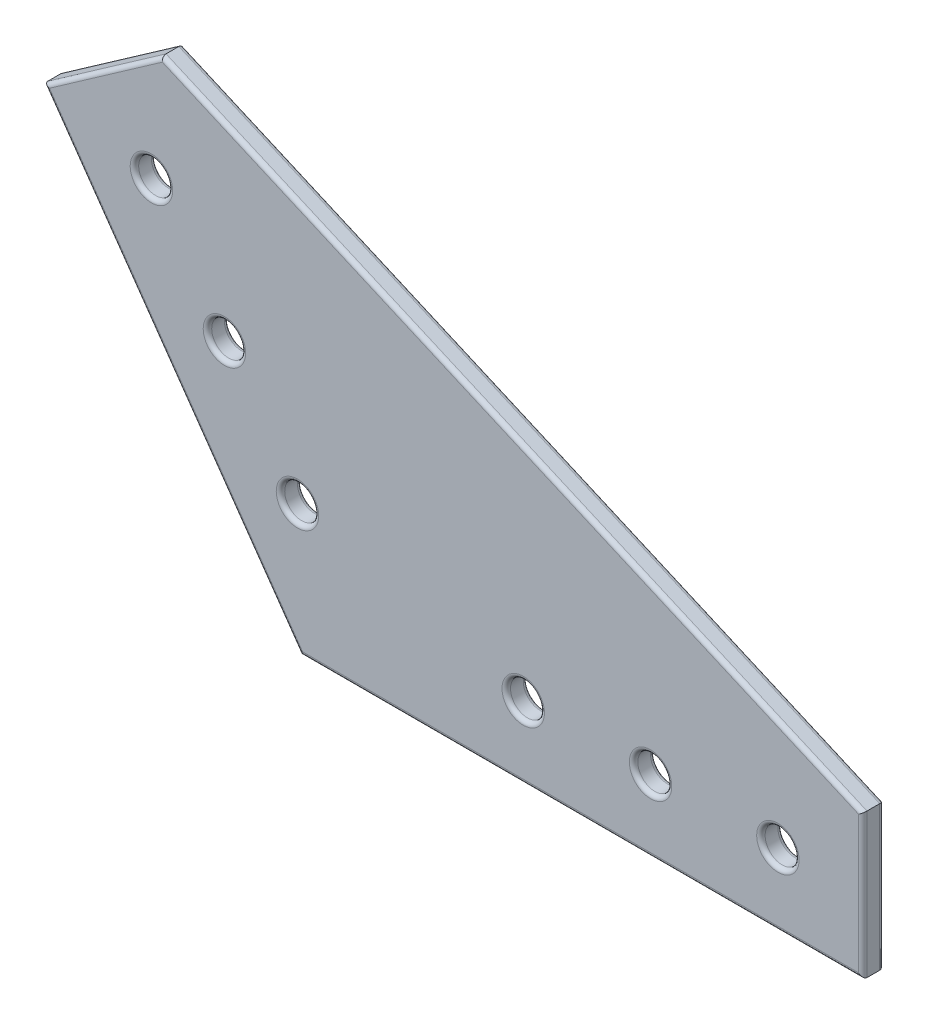
ISO-10303-21;
HEADER;
FILE_DESCRIPTION(('STEP AP214'),'2;1');
FILE_NAME('part.step','',(''),(''),'','','');
FILE_SCHEMA(('AUTOMOTIVE_DESIGN { 1 0 10303 214 1 1 1 1 }'));
ENDSEC;
DATA;
#1=APPLICATION_CONTEXT('core data for automotive mechanical design processes');
#2=APPLICATION_PROTOCOL_DEFINITION('international standard','automotive_design',2000,#1);
#3=PRODUCT_CONTEXT('',#1,'mechanical');
#4=PRODUCT('Part','Part','',(#3));
#5=PRODUCT_RELATED_PRODUCT_CATEGORY('part','',(#4));
#6=PRODUCT_DEFINITION_FORMATION('','',#4);
#7=PRODUCT_DEFINITION_CONTEXT('part definition',#1,'design');
#8=PRODUCT_DEFINITION('design','',#6,#7);
#9=PRODUCT_DEFINITION_SHAPE('','',#8);
#10=(LENGTH_UNIT() NAMED_UNIT(*) SI_UNIT(.MILLI.,.METRE.));
#11=(NAMED_UNIT(*) PLANE_ANGLE_UNIT() SI_UNIT($,.RADIAN.));
#12=(NAMED_UNIT(*) SI_UNIT($,.STERADIAN.) SOLID_ANGLE_UNIT());
#13=UNCERTAINTY_MEASURE_WITH_UNIT(LENGTH_MEASURE(1.E-05),#10,'distance_accuracy_value','');
#14=(GEOMETRIC_REPRESENTATION_CONTEXT(3) GLOBAL_UNCERTAINTY_ASSIGNED_CONTEXT((#13)) GLOBAL_UNIT_ASSIGNED_CONTEXT((#10,
#11,#12)) REPRESENTATION_CONTEXT('',''));
#15=CARTESIAN_POINT('',(0.,0.,0.));
#16=DIRECTION('',(0.,0.,1.));
#17=DIRECTION('',(1.,0.,0.));
#18=AXIS2_PLACEMENT_3D('',#15,#16,#17);
#19=CARTESIAN_POINT('',(-80.9506678256382,-63.8214263174464,5.));
#20=DIRECTION('',(0.819152044288993,0.573576436351045,0.));
#21=DIRECTION('',(-0.573576436351045,0.819152044288993,0.));
#22=AXIS2_PLACEMENT_3D('',#19,#20,#21);
#23=PLANE('',#22);
#24=DIRECTION('',(0.,0.,-1.));
#25=VECTOR('',#24,1.);
#26=CARTESIAN_POINT('',(-141.462981860673,22.5991143550423,5.));
#27=LINE('',#26,#25);
#28=CARTESIAN_POINT('',(-141.462981860673,22.5991143550423,4.));
#29=VERTEX_POINT('',#28);
#30=CARTESIAN_POINT('',(-141.462981860673,22.5991143550423,1.));
#31=VERTEX_POINT('',#30);
#32=EDGE_CURVE('E267',#29,#31,#27,.T.);
#33=ORIENTED_EDGE('',*,*,#32,.T.);
#34=DIRECTION('',(0.573576436351045,-0.819152044288993,0.));
#35=VECTOR('',#34,1.);
#36=CARTESIAN_POINT('',(-80.9506678256382,-63.8214263174464,1.));
#37=LINE('',#36,#35);
#38=CARTESIAN_POINT('',(-80.9506678256382,-63.8214263174464,1.));
#39=VERTEX_POINT('',#38);
#40=EDGE_CURVE('E193',#31,#39,#37,.T.);
#41=ORIENTED_EDGE('',*,*,#40,.T.);
#42=DIRECTION('',(0.,0.,-1.));
#43=VECTOR('',#42,1.);
#44=CARTESIAN_POINT('',(-80.9506678256382,-63.8214263174464,5.));
#45=LINE('',#44,#43);
#46=CARTESIAN_POINT('',(-80.9506678256382,-63.8214263174464,4.));
#47=VERTEX_POINT('',#46);
#48=EDGE_CURVE('E136',#47,#39,#45,.T.);
#49=ORIENTED_EDGE('',*,*,#48,.F.);
#50=DIRECTION('',(0.573576436351045,-0.819152044288993,0.));
#51=VECTOR('',#50,1.);
#52=CARTESIAN_POINT('',(-80.9506678256382,-63.8214263174464,4.));
#53=LINE('',#52,#51);
#54=EDGE_CURVE('E191',#47,#29,#53,.F.);
#55=ORIENTED_EDGE('',*,*,#54,.T.);
#56=EDGE_LOOP('',(#33,#41,#49,#55));
#57=FACE_BOUND('',#56,.T.);
#58=ADVANCED_FACE('F37',(#57),#23,.F.);
#59=CARTESIAN_POINT('',(51.5493321743618,-63.8214263174464,5.));
#60=DIRECTION('',(0.,1.,0.));
#61=DIRECTION('',(0.,0.,1.));
#62=AXIS2_PLACEMENT_3D('',#59,#60,#61);
#63=PLANE('',#62);
#64=ORIENTED_EDGE('',*,*,#48,.T.);
#65=DIRECTION('',(1.,0.,0.));
#66=VECTOR('',#65,1.);
#67=CARTESIAN_POINT('',(51.5493321743618,-63.8214263174464,1.));
#68=LINE('',#67,#66);
#69=CARTESIAN_POINT('',(51.5493321743618,-63.8214263174464,1.));
#70=VERTEX_POINT('',#69);
#71=EDGE_CURVE('E135',#39,#70,#68,.T.);
#72=ORIENTED_EDGE('',*,*,#71,.T.);
#73=DIRECTION('',(0.,0.,-1.));
#74=VECTOR('',#73,1.);
#75=CARTESIAN_POINT('',(51.5493321743618,-63.8214263174464,5.));
#76=LINE('',#75,#74);
#77=CARTESIAN_POINT('',(51.5493321743618,-63.8214263174464,4.));
#78=VERTEX_POINT('',#77);
#79=EDGE_CURVE('E118',#78,#70,#76,.T.);
#80=ORIENTED_EDGE('',*,*,#79,.F.);
#81=DIRECTION('',(1.,0.,0.));
#82=VECTOR('',#81,1.);
#83=CARTESIAN_POINT('',(51.5493321743618,-63.8214263174464,4.));
#84=LINE('',#83,#82);
#85=EDGE_CURVE('E132',#78,#47,#84,.F.);
#86=ORIENTED_EDGE('',*,*,#85,.T.);
#87=EDGE_LOOP('',(#64,#72,#80,#86));
#88=FACE_BOUND('',#87,.T.);
#89=ADVANCED_FACE('F130',(#88),#63,.F.);
#90=CARTESIAN_POINT('',(51.5493321743618,-29.8214263174464,5.));
#91=DIRECTION('',(-1.,0.,0.));
#92=DIRECTION('',(0.,0.,1.));
#93=AXIS2_PLACEMENT_3D('',#90,#91,#92);
#94=PLANE('',#93);
#95=ORIENTED_EDGE('',*,*,#79,.T.);
#96=DIRECTION('',(0.,1.,0.));
#97=VECTOR('',#96,1.);
#98=CARTESIAN_POINT('',(51.5493321743618,-29.8214263174464,1.));
#99=LINE('',#98,#97);
#100=CARTESIAN_POINT('',(51.5493321743618,-29.8214263174464,1.));
#101=VERTEX_POINT('',#100);
#102=EDGE_CURVE('E124',#70,#101,#99,.T.);
#103=ORIENTED_EDGE('',*,*,#102,.T.);
#104=DIRECTION('',(0.,0.,-1.));
#105=VECTOR('',#104,1.);
#106=CARTESIAN_POINT('',(51.5493321743618,-29.8214263174464,5.));
#107=LINE('',#106,#105);
#108=CARTESIAN_POINT('',(51.5493321743618,-29.8214263174464,4.));
#109=VERTEX_POINT('',#108);
#110=EDGE_CURVE('E120',#109,#101,#107,.T.);
#111=ORIENTED_EDGE('',*,*,#110,.F.);
#112=DIRECTION('',(0.,1.,0.));
#113=VECTOR('',#112,1.);
#114=CARTESIAN_POINT('',(51.5493321743618,-29.8214263174464,4.));
#115=LINE('',#114,#113);
#116=EDGE_CURVE('E115',#109,#78,#115,.F.);
#117=ORIENTED_EDGE('',*,*,#116,.T.);
#118=EDGE_LOOP('',(#95,#103,#111,#117));
#119=FACE_BOUND('',#118,.T.);
#120=ADVANCED_FACE('F117',(#119),#94,.F.);
#121=CARTESIAN_POINT('',(-113.611812354848,42.1007131909779,5.));
#122=DIRECTION('',(-0.399253351555718,-0.916840641153918,0.));
#123=DIRECTION('',(0.916840641153918,-0.399253351555718,0.));
#124=AXIS2_PLACEMENT_3D('',#121,#122,#123);
#125=PLANE('',#124);
#126=ORIENTED_EDGE('',*,*,#110,.T.);
#127=DIRECTION('',(-0.916840641153918,0.399253351555718,0.));
#128=VECTOR('',#127,1.);
#129=CARTESIAN_POINT('',(-113.611812354848,42.1007131909779,1.));
#130=LINE('',#129,#128);
#131=CARTESIAN_POINT('',(-113.611812354848,42.1007131909779,1.));
#132=VERTEX_POINT('',#131);
#133=EDGE_CURVE('E184',#101,#132,#130,.T.);
#134=ORIENTED_EDGE('',*,*,#133,.T.);
#135=DIRECTION('',(0.,0.,-1.));
#136=VECTOR('',#135,1.);
#137=CARTESIAN_POINT('',(-113.611812354848,42.1007131909779,5.));
#138=LINE('',#137,#136);
#139=CARTESIAN_POINT('',(-113.611812354848,42.1007131909779,4.));
#140=VERTEX_POINT('',#139);
#141=EDGE_CURVE('E294',#140,#132,#138,.T.);
#142=ORIENTED_EDGE('',*,*,#141,.F.);
#143=DIRECTION('',(-0.916840641153918,0.399253351555718,0.));
#144=VECTOR('',#143,1.);
#145=CARTESIAN_POINT('',(-113.611812354848,42.1007131909779,4.));
#146=LINE('',#145,#144);
#147=EDGE_CURVE('E182',#140,#109,#146,.F.);
#148=ORIENTED_EDGE('',*,*,#147,.T.);
#149=EDGE_LOOP('',(#126,#134,#142,#148));
#150=FACE_BOUND('',#149,.T.);
#151=ADVANCED_FACE('F300',(#150),#125,.F.);
#152=CARTESIAN_POINT('',(-141.462981860673,22.5991143550423,5.));
#153=DIRECTION('',(0.573576436351045,-0.819152044288992,0.));
#154=DIRECTION('',(0.819152044288992,0.573576436351046,0.));
#155=AXIS2_PLACEMENT_3D('',#152,#153,#154);
#156=PLANE('',#155);
#157=ORIENTED_EDGE('',*,*,#141,.T.);
#158=DIRECTION('',(-0.819152044288992,-0.573576436351046,0.));
#159=VECTOR('',#158,1.);
#160=CARTESIAN_POINT('',(-141.462981860673,22.5991143550423,1.));
#161=LINE('',#160,#159);
#162=EDGE_CURVE('E189',#132,#31,#161,.T.);
#163=ORIENTED_EDGE('',*,*,#162,.T.);
#164=ORIENTED_EDGE('',*,*,#32,.F.);
#165=DIRECTION('',(-0.819152044288992,-0.573576436351046,0.));
#166=VECTOR('',#165,1.);
#167=CARTESIAN_POINT('',(-141.462981860673,22.5991143550423,4.));
#168=LINE('',#167,#166);
#169=EDGE_CURVE('E186',#29,#140,#168,.F.);
#170=ORIENTED_EDGE('',*,*,#169,.T.);
#171=EDGE_LOOP('',(#157,#163,#164,#170));
#172=FACE_BOUND('',#171,.T.);
#173=ADVANCED_FACE('F291',(#172),#156,.F.);
#174=CARTESIAN_POINT('',(0.,0.,5.));
#175=DIRECTION('',(0.,0.,-1.));
#176=DIRECTION('',(-1.,0.,0.));
#177=AXIS2_PLACEMENT_3D('',#174,#175,#176);
#178=PLANE('',#177);
#179=DIRECTION('',(-0.916840641153918,0.399253351555718,0.));
#180=VECTOR('',#179,1.);
#181=CARTESIAN_POINT('',(-3.09830661350451,-7.11491440447049,5.));
#182=LINE('',#181,#180);
#183=CARTESIAN_POINT('',(50.5493321743618,-30.4766619401694,5.));
#184=VERTEX_POINT('',#183);
#185=CARTESIAN_POINT('',(-113.497279044767,40.9601356893107,5.));
#186=VERTEX_POINT('',#185);
#187=EDGE_CURVE('E46',#184,#186,#182,.T.);
#188=ORIENTED_EDGE('',*,*,#187,.T.);
#189=DIRECTION('',(-0.819152044288992,-0.573576436351046,0.));
#190=VECTOR('',#189,1.);
#191=CARTESIAN_POINT('',(-56.5844303262186,80.8109413830273,5.));
#192=LINE('',#191,#190);
#193=CARTESIAN_POINT('',(-140.070253380033,22.3535387471044,5.));
#194=VERTEX_POINT('',#193);
#195=EDGE_CURVE('E11',#186,#194,#192,.T.);
#196=ORIENTED_EDGE('',*,*,#195,.T.);
#197=DIRECTION('',(0.573576436351045,-0.819152044288993,0.));
#198=VECTOR('',#197,1.);
#199=CARTESIAN_POINT('',(-83.4858230538149,-58.4574026359229,5.));
#200=LINE('',#199,#198);
#201=CARTESIAN_POINT('',(-80.4301007750865,-62.8214263174464,5.));
#202=VERTEX_POINT('',#201);
#203=EDGE_CURVE('E249',#194,#202,#200,.T.);
#204=ORIENTED_EDGE('',*,*,#203,.T.);
#205=DIRECTION('',(1.,0.,0.));
#206=VECTOR('',#205,1.);
#207=CARTESIAN_POINT('',(0.,-62.8214263174464,5.));
#208=LINE('',#207,#206);
#209=CARTESIAN_POINT('',(50.5493321743618,-62.8214263174464,5.));
#210=VERTEX_POINT('',#209);
#211=EDGE_CURVE('E251',#202,#210,#208,.T.);
#212=ORIENTED_EDGE('',*,*,#211,.T.);
#213=DIRECTION('',(0.,1.,0.));
#214=VECTOR('',#213,1.);
#215=CARTESIAN_POINT('',(50.5493321743618,0.,5.));
#216=LINE('',#215,#214);
#217=EDGE_CURVE('E57',#210,#184,#216,.T.);
#218=ORIENTED_EDGE('',*,*,#217,.T.);
#219=EDGE_LOOP('',(#188,#196,#204,#212,#218));
#220=FACE_BOUND('',#219,.T.);
#221=CARTESIAN_POINT('',(1.5493321743618,-46.8214263174464,5.));
#222=DIRECTION('',(0.,0.,-1.));
#223=DIRECTION('',(-1.,0.,0.));
#224=AXIS2_PLACEMENT_3D('',#221,#222,#223);
#225=CIRCLE('',#224,5.00000000000001);
#226=CARTESIAN_POINT('',(-3.4506678256382,-46.8214263174464,5.));
#227=VERTEX_POINT('',#226);
#228=EDGE_CURVE('E246',#227,#227,#225,.T.);
#229=ORIENTED_EDGE('',*,*,#228,.T.);
#230=EDGE_LOOP('',(#229));
#231=FACE_BOUND('',#230,.T.);
#232=CARTESIAN_POINT('',(-81.6512821996769,-33.1822497701093,5.));
#233=DIRECTION('',(0.,0.,-1.));
#234=DIRECTION('',(-1.,0.,0.));
#235=AXIS2_PLACEMENT_3D('',#232,#233,#234);
#236=CIRCLE('',#235,4.99999999999999);
#237=CARTESIAN_POINT('',(-86.6512821996769,-33.1822497701093,5.));
#238=VERTEX_POINT('',#237);
#239=EDGE_CURVE('E243',#238,#238,#236,.T.);
#240=ORIENTED_EDGE('',*,*,#239,.T.);
#241=EDGE_LOOP('',(#240));
#242=FACE_BOUND('',#241,.T.);
#243=CARTESIAN_POINT('',(-98.8585752902083,-8.60768844143954,5.));
#244=DIRECTION('',(0.,0.,-1.));
#245=DIRECTION('',(-1.,0.,0.));
#246=AXIS2_PLACEMENT_3D('',#243,#244,#245);
#247=CIRCLE('',#246,5.00000000000001);
#248=CARTESIAN_POINT('',(-103.858575290208,-8.60768844143954,5.));
#249=VERTEX_POINT('',#248);
#250=EDGE_CURVE('E240',#249,#249,#247,.T.);
#251=ORIENTED_EDGE('',*,*,#250,.T.);
#252=EDGE_LOOP('',(#251));
#253=FACE_BOUND('',#252,.T.);
#254=CARTESIAN_POINT('',(-116.06586838074,15.9668728872302,5.));
#255=DIRECTION('',(0.,0.,-1.));
#256=DIRECTION('',(-1.,0.,0.));
#257=AXIS2_PLACEMENT_3D('',#254,#255,#256);
#258=CIRCLE('',#257,5.00000000000001);
#259=CARTESIAN_POINT('',(-121.06586838074,15.9668728872302,5.));
#260=VERTEX_POINT('',#259);
#261=EDGE_CURVE('E237',#260,#260,#258,.T.);
#262=ORIENTED_EDGE('',*,*,#261,.T.);
#263=EDGE_LOOP('',(#262));
#264=FACE_BOUND('',#263,.T.);
#265=CARTESIAN_POINT('',(-28.4506678256382,-46.8214263174464,5.));
#266=DIRECTION('',(0.,0.,-1.));
#267=DIRECTION('',(-1.,0.,0.));
#268=AXIS2_PLACEMENT_3D('',#265,#266,#267);
#269=CIRCLE('',#268,5.00000000000001);
#270=CARTESIAN_POINT('',(-33.4506678256382,-46.8214263174464,5.));
#271=VERTEX_POINT('',#270);
#272=EDGE_CURVE('E234',#271,#271,#269,.T.);
#273=ORIENTED_EDGE('',*,*,#272,.T.);
#274=EDGE_LOOP('',(#273));
#275=FACE_BOUND('',#274,.T.);
#276=CARTESIAN_POINT('',(31.5493321743618,-46.8214263174464,5.));
#277=DIRECTION('',(0.,0.,-1.));
#278=DIRECTION('',(-1.,0.,0.));
#279=AXIS2_PLACEMENT_3D('',#276,#277,#278);
#280=CIRCLE('',#279,5.00000000000001);
#281=CARTESIAN_POINT('',(26.5493321743618,-46.8214263174464,5.));
#282=VERTEX_POINT('',#281);
#283=EDGE_CURVE('E231',#282,#282,#280,.T.);
#284=ORIENTED_EDGE('',*,*,#283,.T.);
#285=EDGE_LOOP('',(#284));
#286=FACE_BOUND('',#285,.T.);
#287=ADVANCED_FACE('F281',(#220,#231,#242,#253,#264,#275,#286),#178,.F.);
#288=CARTESIAN_POINT('',(0.,0.,0.));
#289=DIRECTION('',(0.,0.,-1.));
#290=DIRECTION('',(-1.,0.,0.));
#291=AXIS2_PLACEMENT_3D('',#288,#289,#290);
#292=PLANE('',#291);
#293=DIRECTION('',(0.,1.,0.));
#294=VECTOR('',#293,1.);
#295=CARTESIAN_POINT('',(50.5493321743618,-63.8214263174464,0.));
#296=LINE('',#295,#294);
#297=CARTESIAN_POINT('',(50.5493321743618,-30.4766619401694,0.));
#298=VERTEX_POINT('',#297);
#299=CARTESIAN_POINT('',(50.5493321743618,-62.8214263174464,0.));
#300=VERTEX_POINT('',#299);
#301=EDGE_CURVE('E177',#298,#300,#296,.F.);
#302=ORIENTED_EDGE('',*,*,#301,.T.);
#303=DIRECTION('',(1.,0.,0.));
#304=VECTOR('',#303,1.);
#305=CARTESIAN_POINT('',(-80.9506678256382,-62.8214263174464,0.));
#306=LINE('',#305,#304);
#307=CARTESIAN_POINT('',(-80.4301007750864,-62.8214263174464,0.));
#308=VERTEX_POINT('',#307);
#309=EDGE_CURVE('E125',#300,#308,#306,.F.);
#310=ORIENTED_EDGE('',*,*,#309,.T.);
#311=DIRECTION('',(0.573576436351045,-0.819152044288993,0.));
#312=VECTOR('',#311,1.);
#313=CARTESIAN_POINT('',(-140.643829816384,23.1726907913934,0.));
#314=LINE('',#313,#312);
#315=CARTESIAN_POINT('',(-140.070253380033,22.3535387471044,0.));
#316=VERTEX_POINT('',#315);
#317=EDGE_CURVE('E171',#308,#316,#314,.F.);
#318=ORIENTED_EDGE('',*,*,#317,.T.);
#319=DIRECTION('',(-0.819152044288992,-0.573576436351046,0.));
#320=VECTOR('',#319,1.);
#321=CARTESIAN_POINT('',(-113.038235918497,41.2815611466889,0.));
#322=LINE('',#321,#320);
#323=CARTESIAN_POINT('',(-113.497279044767,40.9601356893107,0.));
#324=VERTEX_POINT('',#323);
#325=EDGE_CURVE('E173',#316,#324,#322,.F.);
#326=ORIENTED_EDGE('',*,*,#325,.T.);
#327=DIRECTION('',(-0.916840641153918,0.399253351555718,0.));
#328=VECTOR('',#327,1.);
#329=CARTESIAN_POINT('',(51.1500788228061,-30.7382669586003,0.));
#330=LINE('',#329,#328);
#331=EDGE_CURVE('E175',#324,#298,#330,.F.);
#332=ORIENTED_EDGE('',*,*,#331,.T.);
#333=EDGE_LOOP('',(#302,#310,#318,#326,#332));
#334=FACE_BOUND('',#333,.T.);
#335=CARTESIAN_POINT('',(1.5493321743618,-46.8214263174464,0.));
#336=DIRECTION('',(0.,0.,-1.));
#337=DIRECTION('',(-1.,0.,0.));
#338=AXIS2_PLACEMENT_3D('',#335,#336,#337);
#339=CIRCLE('',#338,5.00000000000001);
#340=CARTESIAN_POINT('',(-3.4506678256382,-46.8214263174464,0.));
#341=VERTEX_POINT('',#340);
#342=EDGE_CURVE('E168',#341,#341,#339,.F.);
#343=ORIENTED_EDGE('',*,*,#342,.T.);
#344=EDGE_LOOP('',(#343));
#345=FACE_BOUND('',#344,.T.);
#346=CARTESIAN_POINT('',(-81.6512821996769,-33.1822497701093,0.));
#347=DIRECTION('',(0.,0.,-1.));
#348=DIRECTION('',(-1.,0.,0.));
#349=AXIS2_PLACEMENT_3D('',#346,#347,#348);
#350=CIRCLE('',#349,4.99999999999999);
#351=CARTESIAN_POINT('',(-86.6512821996769,-33.1822497701093,0.));
#352=VERTEX_POINT('',#351);
#353=EDGE_CURVE('E165',#352,#352,#350,.F.);
#354=ORIENTED_EDGE('',*,*,#353,.T.);
#355=EDGE_LOOP('',(#354));
#356=FACE_BOUND('',#355,.T.);
#357=CARTESIAN_POINT('',(-98.8585752902083,-8.60768844143954,0.));
#358=DIRECTION('',(0.,0.,-1.));
#359=DIRECTION('',(-1.,0.,0.));
#360=AXIS2_PLACEMENT_3D('',#357,#358,#359);
#361=CIRCLE('',#360,5.00000000000001);
#362=CARTESIAN_POINT('',(-103.858575290208,-8.60768844143954,0.));
#363=VERTEX_POINT('',#362);
#364=EDGE_CURVE('E162',#363,#363,#361,.F.);
#365=ORIENTED_EDGE('',*,*,#364,.T.);
#366=EDGE_LOOP('',(#365));
#367=FACE_BOUND('',#366,.T.);
#368=CARTESIAN_POINT('',(-116.06586838074,15.9668728872302,0.));
#369=DIRECTION('',(0.,0.,-1.));
#370=DIRECTION('',(-1.,0.,0.));
#371=AXIS2_PLACEMENT_3D('',#368,#369,#370);
#372=CIRCLE('',#371,5.00000000000001);
#373=CARTESIAN_POINT('',(-121.06586838074,15.9668728872302,0.));
#374=VERTEX_POINT('',#373);
#375=EDGE_CURVE('E159',#374,#374,#372,.F.);
#376=ORIENTED_EDGE('',*,*,#375,.T.);
#377=EDGE_LOOP('',(#376));
#378=FACE_BOUND('',#377,.T.);
#379=CARTESIAN_POINT('',(-28.4506678256382,-46.8214263174464,0.));
#380=DIRECTION('',(0.,0.,-1.));
#381=DIRECTION('',(-1.,0.,0.));
#382=AXIS2_PLACEMENT_3D('',#379,#380,#381);
#383=CIRCLE('',#382,5.00000000000001);
#384=CARTESIAN_POINT('',(-33.4506678256382,-46.8214263174464,0.));
#385=VERTEX_POINT('',#384);
#386=EDGE_CURVE('E156',#385,#385,#383,.F.);
#387=ORIENTED_EDGE('',*,*,#386,.T.);
#388=EDGE_LOOP('',(#387));
#389=FACE_BOUND('',#388,.T.);
#390=CARTESIAN_POINT('',(31.5493321743618,-46.8214263174464,0.));
#391=DIRECTION('',(0.,0.,-1.));
#392=DIRECTION('',(-1.,0.,0.));
#393=AXIS2_PLACEMENT_3D('',#390,#391,#392);
#394=CIRCLE('',#393,5.00000000000001);
#395=CARTESIAN_POINT('',(26.5493321743618,-46.8214263174464,0.));
#396=VERTEX_POINT('',#395);
#397=EDGE_CURVE('E150',#396,#396,#394,.F.);
#398=ORIENTED_EDGE('',*,*,#397,.T.);
#399=EDGE_LOOP('',(#398));
#400=FACE_BOUND('',#399,.T.);
#401=ADVANCED_FACE('F313',(#334,#345,#356,#367,#378,#389,#400),#292,.T.);
#402=CARTESIAN_POINT('',(1.5493321743618,-46.8214263174464,0.));
#403=DIRECTION('',(0.,0.,1.));
#404=DIRECTION('',(1.,0.,0.));
#405=AXIS2_PLACEMENT_3D('',#402,#403,#404);
#406=CYLINDRICAL_SURFACE('',#405,4.00000000000001);
#407=CARTESIAN_POINT('',(1.5493321743618,-46.8214263174464,1.));
#408=DIRECTION('',(0.,0.,-1.));
#409=DIRECTION('',(-1.,0.,0.));
#410=AXIS2_PLACEMENT_3D('',#407,#408,#409);
#411=CIRCLE('',#410,4.00000000000001);
#412=CARTESIAN_POINT('',(-2.4506678256382,-46.8214263174464,1.));
#413=VERTEX_POINT('',#412);
#414=EDGE_CURVE('E198',#413,#413,#411,.T.);
#415=ORIENTED_EDGE('',*,*,#414,.T.);
#416=EDGE_LOOP('',(#415));
#417=FACE_BOUND('',#416,.T.);
#418=CARTESIAN_POINT('',(1.5493321743618,-46.8214263174464,4.));
#419=DIRECTION('',(0.,0.,-1.));
#420=DIRECTION('',(-1.,0.,0.));
#421=AXIS2_PLACEMENT_3D('',#418,#419,#420);
#422=CIRCLE('',#421,4.00000000000001);
#423=CARTESIAN_POINT('',(-2.4506678256382,-46.8214263174464,4.));
#424=VERTEX_POINT('',#423);
#425=EDGE_CURVE('E195',#424,#424,#422,.F.);
#426=ORIENTED_EDGE('',*,*,#425,.T.);
#427=EDGE_LOOP('',(#426));
#428=FACE_BOUND('',#427,.T.);
#429=ADVANCED_FACE('F572',(#417,#428),#406,.F.);
#430=CARTESIAN_POINT('',(-81.6512821996769,-33.1822497701093,0.));
#431=DIRECTION('',(0.,0.,1.));
#432=DIRECTION('',(1.,0.,0.));
#433=AXIS2_PLACEMENT_3D('',#430,#431,#432);
#434=CYLINDRICAL_SURFACE('',#433,3.99999999999999);
#435=CARTESIAN_POINT('',(-81.6512821996769,-33.1822497701093,1.));
#436=DIRECTION('',(0.,0.,-1.));
#437=DIRECTION('',(-1.,0.,0.));
#438=AXIS2_PLACEMENT_3D('',#435,#436,#437);
#439=CIRCLE('',#438,3.99999999999999);
#440=CARTESIAN_POINT('',(-85.6512821996769,-33.1822497701093,1.));
#441=VERTEX_POINT('',#440);
#442=EDGE_CURVE('E204',#441,#441,#439,.T.);
#443=ORIENTED_EDGE('',*,*,#442,.T.);
#444=EDGE_LOOP('',(#443));
#445=FACE_BOUND('',#444,.T.);
#446=CARTESIAN_POINT('',(-81.6512821996769,-33.1822497701093,4.));
#447=DIRECTION('',(0.,0.,-1.));
#448=DIRECTION('',(-1.,0.,0.));
#449=AXIS2_PLACEMENT_3D('',#446,#447,#448);
#450=CIRCLE('',#449,3.99999999999999);
#451=CARTESIAN_POINT('',(-85.6512821996769,-33.1822497701093,4.));
#452=VERTEX_POINT('',#451);
#453=EDGE_CURVE('E201',#452,#452,#450,.F.);
#454=ORIENTED_EDGE('',*,*,#453,.T.);
#455=EDGE_LOOP('',(#454));
#456=FACE_BOUND('',#455,.T.);
#457=ADVANCED_FACE('F563',(#445,#456),#434,.F.);
#458=CARTESIAN_POINT('',(-98.8585752902083,-8.60768844143954,0.));
#459=DIRECTION('',(0.,0.,1.));
#460=DIRECTION('',(1.,0.,0.));
#461=AXIS2_PLACEMENT_3D('',#458,#459,#460);
#462=CYLINDRICAL_SURFACE('',#461,4.00000000000001);
#463=CARTESIAN_POINT('',(-98.8585752902083,-8.60768844143954,1.));
#464=DIRECTION('',(0.,0.,-1.));
#465=DIRECTION('',(-1.,0.,0.));
#466=AXIS2_PLACEMENT_3D('',#463,#464,#465);
#467=CIRCLE('',#466,4.00000000000001);
#468=CARTESIAN_POINT('',(-102.858575290208,-8.60768844143954,1.));
#469=VERTEX_POINT('',#468);
#470=EDGE_CURVE('E210',#469,#469,#467,.T.);
#471=ORIENTED_EDGE('',*,*,#470,.T.);
#472=EDGE_LOOP('',(#471));
#473=FACE_BOUND('',#472,.T.);
#474=CARTESIAN_POINT('',(-98.8585752902083,-8.60768844143954,4.));
#475=DIRECTION('',(0.,0.,-1.));
#476=DIRECTION('',(-1.,0.,0.));
#477=AXIS2_PLACEMENT_3D('',#474,#475,#476);
#478=CIRCLE('',#477,4.00000000000001);
#479=CARTESIAN_POINT('',(-102.858575290208,-8.60768844143954,4.));
#480=VERTEX_POINT('',#479);
#481=EDGE_CURVE('E207',#480,#480,#478,.F.);
#482=ORIENTED_EDGE('',*,*,#481,.T.);
#483=EDGE_LOOP('',(#482));
#484=FACE_BOUND('',#483,.T.);
#485=ADVANCED_FACE('F554',(#473,#484),#462,.F.);
#486=CARTESIAN_POINT('',(-116.06586838074,15.9668728872302,0.));
#487=DIRECTION('',(0.,0.,1.));
#488=DIRECTION('',(1.,0.,0.));
#489=AXIS2_PLACEMENT_3D('',#486,#487,#488);
#490=CYLINDRICAL_SURFACE('',#489,4.00000000000001);
#491=CARTESIAN_POINT('',(-116.06586838074,15.9668728872302,1.));
#492=DIRECTION('',(0.,0.,-1.));
#493=DIRECTION('',(-1.,0.,0.));
#494=AXIS2_PLACEMENT_3D('',#491,#492,#493);
#495=CIRCLE('',#494,4.00000000000001);
#496=CARTESIAN_POINT('',(-120.06586838074,15.9668728872302,1.));
#497=VERTEX_POINT('',#496);
#498=EDGE_CURVE('E216',#497,#497,#495,.T.);
#499=ORIENTED_EDGE('',*,*,#498,.T.);
#500=EDGE_LOOP('',(#499));
#501=FACE_BOUND('',#500,.T.);
#502=CARTESIAN_POINT('',(-116.06586838074,15.9668728872302,4.));
#503=DIRECTION('',(0.,0.,-1.));
#504=DIRECTION('',(-1.,0.,0.));
#505=AXIS2_PLACEMENT_3D('',#502,#503,#504);
#506=CIRCLE('',#505,4.00000000000001);
#507=CARTESIAN_POINT('',(-120.06586838074,15.9668728872302,4.));
#508=VERTEX_POINT('',#507);
#509=EDGE_CURVE('E213',#508,#508,#506,.F.);
#510=ORIENTED_EDGE('',*,*,#509,.T.);
#511=EDGE_LOOP('',(#510));
#512=FACE_BOUND('',#511,.T.);
#513=ADVANCED_FACE('F545',(#501,#512),#490,.F.);
#514=CARTESIAN_POINT('',(-28.4506678256382,-46.8214263174464,0.));
#515=DIRECTION('',(0.,0.,1.));
#516=DIRECTION('',(1.,0.,0.));
#517=AXIS2_PLACEMENT_3D('',#514,#515,#516);
#518=CYLINDRICAL_SURFACE('',#517,4.00000000000001);
#519=CARTESIAN_POINT('',(-28.4506678256382,-46.8214263174464,1.));
#520=DIRECTION('',(0.,0.,-1.));
#521=DIRECTION('',(-1.,0.,0.));
#522=AXIS2_PLACEMENT_3D('',#519,#520,#521);
#523=CIRCLE('',#522,4.00000000000001);
#524=CARTESIAN_POINT('',(-32.4506678256382,-46.8214263174464,1.));
#525=VERTEX_POINT('',#524);
#526=EDGE_CURVE('E222',#525,#525,#523,.T.);
#527=ORIENTED_EDGE('',*,*,#526,.T.);
#528=EDGE_LOOP('',(#527));
#529=FACE_BOUND('',#528,.T.);
#530=CARTESIAN_POINT('',(-28.4506678256382,-46.8214263174464,4.));
#531=DIRECTION('',(0.,0.,-1.));
#532=DIRECTION('',(-1.,0.,0.));
#533=AXIS2_PLACEMENT_3D('',#530,#531,#532);
#534=CIRCLE('',#533,4.00000000000001);
#535=CARTESIAN_POINT('',(-32.4506678256382,-46.8214263174464,4.));
#536=VERTEX_POINT('',#535);
#537=EDGE_CURVE('E219',#536,#536,#534,.F.);
#538=ORIENTED_EDGE('',*,*,#537,.T.);
#539=EDGE_LOOP('',(#538));
#540=FACE_BOUND('',#539,.T.);
#541=ADVANCED_FACE('F333',(#529,#540),#518,.F.);
#542=CARTESIAN_POINT('',(31.5493321743618,-46.8214263174464,0.));
#543=DIRECTION('',(0.,0.,1.));
#544=DIRECTION('',(1.,0.,0.));
#545=AXIS2_PLACEMENT_3D('',#542,#543,#544);
#546=CYLINDRICAL_SURFACE('',#545,4.00000000000001);
#547=CARTESIAN_POINT('',(31.5493321743618,-46.8214263174464,1.));
#548=DIRECTION('',(0.,0.,-1.));
#549=DIRECTION('',(-1.,0.,0.));
#550=AXIS2_PLACEMENT_3D('',#547,#548,#549);
#551=CIRCLE('',#550,4.00000000000001);
#552=CARTESIAN_POINT('',(27.5493321743618,-46.8214263174464,1.));
#553=VERTEX_POINT('',#552);
#554=EDGE_CURVE('E228',#553,#553,#551,.T.);
#555=ORIENTED_EDGE('',*,*,#554,.T.);
#556=EDGE_LOOP('',(#555));
#557=FACE_BOUND('',#556,.T.);
#558=CARTESIAN_POINT('',(31.5493321743618,-46.8214263174464,4.));
#559=DIRECTION('',(0.,0.,-1.));
#560=DIRECTION('',(-1.,0.,0.));
#561=AXIS2_PLACEMENT_3D('',#558,#559,#560);
#562=CIRCLE('',#561,4.00000000000001);
#563=CARTESIAN_POINT('',(27.5493321743618,-46.8214263174464,4.));
#564=VERTEX_POINT('',#563);
#565=EDGE_CURVE('E225',#564,#564,#562,.F.);
#566=ORIENTED_EDGE('',*,*,#565,.T.);
#567=EDGE_LOOP('',(#566));
#568=FACE_BOUND('',#567,.T.);
#569=ADVANCED_FACE('F326',(#557,#568),#546,.F.);
#570=CARTESIAN_POINT('',(-140.889405424322,21.7799623107533,1.));
#571=DIRECTION('',(0.819152044288992,0.573576436351046,0.));
#572=DIRECTION('',(-0.573576436351045,0.819152044288992,0.));
#573=AXIS2_PLACEMENT_3D('',#570,#571,#572);
#574=CYLINDRICAL_SURFACE('',#573,1.);
#575=CARTESIAN_POINT('',(-140.070253380033,22.3535387471043,1.));
#576=DIRECTION('',(0.173648177666932,0.984807753012208,0.));
#577=DIRECTION('',(-0.984807753012208,0.173648177666932,0.));
#578=AXIS2_PLACEMENT_3D('',#575,#576,#577);
#579=ELLIPSE('',#578,1.41421356237309,1.);
#580=EDGE_CURVE('E261',#31,#316,#579,.F.);
#581=ORIENTED_EDGE('',*,*,#580,.F.);
#582=ORIENTED_EDGE('',*,*,#162,.F.);
#583=CARTESIAN_POINT('',(-113.497279044767,40.9601356893107,1.));
#584=DIRECTION('',(0.994996030161679,0.0999144632298007,0.));
#585=DIRECTION('',(-0.0999144632298007,0.994996030161679,0.));
#586=AXIS2_PLACEMENT_3D('',#583,#584,#585);
#587=ELLIPSE('',#586,1.14631362044918,1.);
#588=EDGE_CURVE('E264',#324,#132,#587,.T.);
#589=ORIENTED_EDGE('',*,*,#588,.F.);
#590=ORIENTED_EDGE('',*,*,#325,.F.);
#591=EDGE_LOOP('',(#581,#582,#589,#590));
#592=FACE_BOUND('',#591,.T.);
#593=ADVANCED_FACE('F324',(#592),#574,.T.);
#594=CARTESIAN_POINT('',(-114.011065706403,41.183872549824,1.));
#595=DIRECTION('',(0.916840641153918,-0.399253351555718,0.));
#596=DIRECTION('',(0.399253351555718,0.916840641153918,0.));
#597=AXIS2_PLACEMENT_3D('',#594,#595,#596);
#598=CYLINDRICAL_SURFACE('',#597,1.);
#599=ORIENTED_EDGE('',*,*,#588,.T.);
#600=ORIENTED_EDGE('',*,*,#133,.F.);
#601=CARTESIAN_POINT('',(50.5493321743618,-30.4766619401694,1.));
#602=DIRECTION('',(0.54806324837754,-0.83643689288425,0.));
#603=DIRECTION('',(0.83643689288425,0.54806324837754,0.));
#604=AXIS2_PLACEMENT_3D('',#601,#602,#603);
#605=ELLIPSE('',#604,1.19554745672652,1.);
#606=EDGE_CURVE('E258',#298,#101,#605,.T.);
#607=ORIENTED_EDGE('',*,*,#606,.F.);
#608=ORIENTED_EDGE('',*,*,#331,.F.);
#609=EDGE_LOOP('',(#599,#600,#607,#608));
#610=FACE_BOUND('',#609,.T.);
#611=ADVANCED_FACE('F303',(#610),#598,.T.);
#612=CARTESIAN_POINT('',(-80.1315157813492,-63.2478498810954,1.));
#613=DIRECTION('',(-0.573576436351045,0.819152044288993,0.));
#614=DIRECTION('',(-0.819152044288993,-0.573576436351045,0.));
#615=AXIS2_PLACEMENT_3D('',#612,#613,#614);
#616=CYLINDRICAL_SURFACE('',#615,1.);
#617=ORIENTED_EDGE('',*,*,#580,.T.);
#618=ORIENTED_EDGE('',*,*,#317,.F.);
#619=CARTESIAN_POINT('',(-80.4301007750864,-62.8214263174464,1.));
#620=DIRECTION('',(-0.887010833178221,0.461748613235035,0.));
#621=DIRECTION('',(0.461748613235035,0.887010833178221,0.));
#622=AXIS2_PLACEMENT_3D('',#619,#620,#621);
#623=ELLIPSE('',#622,1.12738194686634,1.);
#624=EDGE_CURVE('E256',#39,#308,#623,.F.);
#625=ORIENTED_EDGE('',*,*,#624,.F.);
#626=ORIENTED_EDGE('',*,*,#40,.F.);
#627=EDGE_LOOP('',(#617,#618,#625,#626));
#628=FACE_BOUND('',#627,.T.);
#629=ADVANCED_FACE('F321',(#628),#616,.T.);
#630=CARTESIAN_POINT('',(50.5493321743618,-29.8214263174464,1.));
#631=DIRECTION('',(0.,-1.,0.));
#632=DIRECTION('',(0.,0.,-1.));
#633=AXIS2_PLACEMENT_3D('',#630,#631,#632);
#634=CYLINDRICAL_SURFACE('',#633,1.);
#635=ORIENTED_EDGE('',*,*,#606,.T.);
#636=ORIENTED_EDGE('',*,*,#102,.F.);
#637=CARTESIAN_POINT('',(50.5493321743618,-62.8214263174464,1.));
#638=DIRECTION('',(-0.707106781186547,-0.707106781186547,0.));
#639=DIRECTION('',(0.707106781186547,-0.707106781186547,0.));
#640=AXIS2_PLACEMENT_3D('',#637,#638,#639);
#641=ELLIPSE('',#640,1.41421356237309,1.);
#642=EDGE_CURVE('E142',#300,#70,#641,.T.);
#643=ORIENTED_EDGE('',*,*,#642,.F.);
#644=ORIENTED_EDGE('',*,*,#301,.F.);
#645=EDGE_LOOP('',(#635,#636,#643,#644));
#646=FACE_BOUND('',#645,.T.);
#647=ADVANCED_FACE('F309',(#646),#634,.T.);
#648=CARTESIAN_POINT('',(51.5493321743618,-62.8214263174464,1.));
#649=DIRECTION('',(-1.,0.,0.));
#650=DIRECTION('',(0.,0.,1.));
#651=AXIS2_PLACEMENT_3D('',#648,#649,#650);
#652=CYLINDRICAL_SURFACE('',#651,1.);
#653=ORIENTED_EDGE('',*,*,#624,.T.);
#654=ORIENTED_EDGE('',*,*,#309,.F.);
#655=ORIENTED_EDGE('',*,*,#642,.T.);
#656=ORIENTED_EDGE('',*,*,#71,.F.);
#657=EDGE_LOOP('',(#653,#654,#655,#656));
#658=FACE_BOUND('',#657,.T.);
#659=ADVANCED_FACE('F316',(#658),#652,.T.);
#660=CARTESIAN_POINT('',(1.5493321743618,-46.8214263174464,1.));
#661=DIRECTION('',(0.,0.,-1.));
#662=DIRECTION('',(-1.,0.,0.));
#663=AXIS2_PLACEMENT_3D('',#660,#661,#662);
#664=TOROIDAL_SURFACE('',#663,5.00000000000001,1.);
#665=ORIENTED_EDGE('',*,*,#414,.F.);
#666=EDGE_LOOP('',(#665));
#667=FACE_BOUND('',#666,.T.);
#668=ORIENTED_EDGE('',*,*,#342,.F.);
#669=EDGE_LOOP('',(#668));
#670=FACE_BOUND('',#669,.T.);
#671=ADVANCED_FACE('F347',(#667,#670),#664,.T.);
#672=CARTESIAN_POINT('',(-81.6512821996769,-33.1822497701093,1.));
#673=DIRECTION('',(0.,0.,-1.));
#674=DIRECTION('',(-1.,0.,0.));
#675=AXIS2_PLACEMENT_3D('',#672,#673,#674);
#676=TOROIDAL_SURFACE('',#675,4.99999999999999,1.);
#677=ORIENTED_EDGE('',*,*,#442,.F.);
#678=EDGE_LOOP('',(#677));
#679=FACE_BOUND('',#678,.T.);
#680=ORIENTED_EDGE('',*,*,#353,.F.);
#681=EDGE_LOOP('',(#680));
#682=FACE_BOUND('',#681,.T.);
#683=ADVANCED_FACE('F369',(#679,#682),#676,.T.);
#684=CARTESIAN_POINT('',(-98.8585752902083,-8.60768844143954,1.));
#685=DIRECTION('',(0.,0.,-1.));
#686=DIRECTION('',(-1.,0.,0.));
#687=AXIS2_PLACEMENT_3D('',#684,#685,#686);
#688=TOROIDAL_SURFACE('',#687,5.00000000000001,1.);
#689=ORIENTED_EDGE('',*,*,#470,.F.);
#690=EDGE_LOOP('',(#689));
#691=FACE_BOUND('',#690,.T.);
#692=ORIENTED_EDGE('',*,*,#364,.F.);
#693=EDGE_LOOP('',(#692));
#694=FACE_BOUND('',#693,.T.);
#695=ADVANCED_FACE('F376',(#691,#694),#688,.T.);
#696=CARTESIAN_POINT('',(-116.06586838074,15.9668728872302,1.));
#697=DIRECTION('',(0.,0.,-1.));
#698=DIRECTION('',(-1.,0.,0.));
#699=AXIS2_PLACEMENT_3D('',#696,#697,#698);
#700=TOROIDAL_SURFACE('',#699,5.00000000000001,1.);
#701=ORIENTED_EDGE('',*,*,#498,.F.);
#702=EDGE_LOOP('',(#701));
#703=FACE_BOUND('',#702,.T.);
#704=ORIENTED_EDGE('',*,*,#375,.F.);
#705=EDGE_LOOP('',(#704));
#706=FACE_BOUND('',#705,.T.);
#707=ADVANCED_FACE('F384',(#703,#706),#700,.T.);
#708=CARTESIAN_POINT('',(-28.4506678256382,-46.8214263174464,1.));
#709=DIRECTION('',(0.,0.,-1.));
#710=DIRECTION('',(-1.,0.,0.));
#711=AXIS2_PLACEMENT_3D('',#708,#709,#710);
#712=TOROIDAL_SURFACE('',#711,5.00000000000001,1.);
#713=ORIENTED_EDGE('',*,*,#526,.F.);
#714=EDGE_LOOP('',(#713));
#715=FACE_BOUND('',#714,.T.);
#716=ORIENTED_EDGE('',*,*,#386,.F.);
#717=EDGE_LOOP('',(#716));
#718=FACE_BOUND('',#717,.T.);
#719=ADVANCED_FACE('F392',(#715,#718),#712,.T.);
#720=CARTESIAN_POINT('',(31.5493321743618,-46.8214263174464,1.));
#721=DIRECTION('',(0.,0.,-1.));
#722=DIRECTION('',(-1.,0.,0.));
#723=AXIS2_PLACEMENT_3D('',#720,#721,#722);
#724=TOROIDAL_SURFACE('',#723,5.00000000000001,1.);
#725=ORIENTED_EDGE('',*,*,#554,.F.);
#726=EDGE_LOOP('',(#725));
#727=FACE_BOUND('',#726,.T.);
#728=ORIENTED_EDGE('',*,*,#397,.F.);
#729=EDGE_LOOP('',(#728));
#730=FACE_BOUND('',#729,.T.);
#731=ADVANCED_FACE('F400',(#727,#730),#724,.T.);
#732=CARTESIAN_POINT('',(50.5493321743618,0.,4.));
#733=DIRECTION('',(0.,1.,0.));
#734=DIRECTION('',(0.,0.,1.));
#735=AXIS2_PLACEMENT_3D('',#732,#733,#734);
#736=CYLINDRICAL_SURFACE('',#735,1.);
#737=CARTESIAN_POINT('',(50.5493321743618,-30.4766619401694,4.));
#738=DIRECTION('',(-0.54806324837754,0.83643689288425,0.));
#739=DIRECTION('',(0.83643689288425,0.54806324837754,0.));
#740=AXIS2_PLACEMENT_3D('',#737,#738,#739);
#741=ELLIPSE('',#740,1.19554745672652,1.);
#742=EDGE_CURVE('E143',#184,#109,#741,.T.);
#743=ORIENTED_EDGE('',*,*,#742,.F.);
#744=ORIENTED_EDGE('',*,*,#217,.F.);
#745=CARTESIAN_POINT('',(50.5493321743618,-62.8214263174464,4.));
#746=DIRECTION('',(0.707106781186547,0.707106781186547,0.));
#747=DIRECTION('',(0.707106781186547,-0.707106781186547,0.));
#748=AXIS2_PLACEMENT_3D('',#745,#746,#747);
#749=ELLIPSE('',#748,1.41421356237309,1.);
#750=EDGE_CURVE('E41',#78,#210,#749,.F.);
#751=ORIENTED_EDGE('',*,*,#750,.F.);
#752=ORIENTED_EDGE('',*,*,#116,.F.);
#753=EDGE_LOOP('',(#743,#744,#751,#752));
#754=FACE_BOUND('',#753,.T.);
#755=ADVANCED_FACE('F139',(#754),#736,.T.);
#756=CARTESIAN_POINT('',(0.,-62.8214263174464,4.));
#757=DIRECTION('',(1.,0.,0.));
#758=DIRECTION('',(0.,0.,-1.));
#759=AXIS2_PLACEMENT_3D('',#756,#757,#758);
#760=CYLINDRICAL_SURFACE('',#759,1.);
#761=ORIENTED_EDGE('',*,*,#750,.T.);
#762=ORIENTED_EDGE('',*,*,#211,.F.);
#763=CARTESIAN_POINT('',(-80.4301007750865,-62.8214263174464,4.));
#764=DIRECTION('',(0.887010833178221,-0.461748613235035,0.));
#765=DIRECTION('',(-0.461748613235035,-0.887010833178221,0.));
#766=AXIS2_PLACEMENT_3D('',#763,#764,#765);
#767=ELLIPSE('',#766,1.12738194686634,1.);
#768=EDGE_CURVE('E147',#47,#202,#767,.F.);
#769=ORIENTED_EDGE('',*,*,#768,.F.);
#770=ORIENTED_EDGE('',*,*,#85,.F.);
#771=EDGE_LOOP('',(#761,#762,#769,#770));
#772=FACE_BOUND('',#771,.T.);
#773=ADVANCED_FACE('F145',(#772),#760,.T.);
#774=CARTESIAN_POINT('',(-3.09830661350451,-7.11491440447049,4.));
#775=DIRECTION('',(-0.916840641153918,0.399253351555718,0.));
#776=DIRECTION('',(-0.399253351555718,-0.916840641153918,0.));
#777=AXIS2_PLACEMENT_3D('',#774,#775,#776);
#778=CYLINDRICAL_SURFACE('',#777,1.);
#779=ORIENTED_EDGE('',*,*,#742,.T.);
#780=ORIENTED_EDGE('',*,*,#147,.F.);
#781=CARTESIAN_POINT('',(-113.497279044767,40.9601356893107,4.));
#782=DIRECTION('',(-0.994996030161679,-0.0999144632298007,0.));
#783=DIRECTION('',(-0.0999144632298007,0.994996030161679,0.));
#784=AXIS2_PLACEMENT_3D('',#781,#782,#783);
#785=ELLIPSE('',#784,1.14631362044918,1.);
#786=EDGE_CURVE('E270',#186,#140,#785,.T.);
#787=ORIENTED_EDGE('',*,*,#786,.F.);
#788=ORIENTED_EDGE('',*,*,#187,.F.);
#789=EDGE_LOOP('',(#779,#780,#787,#788));
#790=FACE_BOUND('',#789,.T.);
#791=ADVANCED_FACE('F274',(#790),#778,.T.);
#792=CARTESIAN_POINT('',(-83.4858230538149,-58.4574026359229,4.));
#793=DIRECTION('',(0.573576436351045,-0.819152044288993,0.));
#794=DIRECTION('',(0.819152044288993,0.573576436351045,0.));
#795=AXIS2_PLACEMENT_3D('',#792,#793,#794);
#796=CYLINDRICAL_SURFACE('',#795,1.);
#797=ORIENTED_EDGE('',*,*,#768,.T.);
#798=ORIENTED_EDGE('',*,*,#203,.F.);
#799=CARTESIAN_POINT('',(-140.070253380033,22.3535387471043,4.));
#800=DIRECTION('',(-0.173648177666932,-0.984807753012208,0.));
#801=DIRECTION('',(0.984807753012208,-0.173648177666932,0.));
#802=AXIS2_PLACEMENT_3D('',#799,#800,#801);
#803=ELLIPSE('',#802,1.41421356237309,1.);
#804=EDGE_CURVE('E268',#29,#194,#803,.F.);
#805=ORIENTED_EDGE('',*,*,#804,.F.);
#806=ORIENTED_EDGE('',*,*,#54,.F.);
#807=EDGE_LOOP('',(#797,#798,#805,#806));
#808=FACE_BOUND('',#807,.T.);
#809=ADVANCED_FACE('F284',(#808),#796,.T.);
#810=CARTESIAN_POINT('',(-56.5844303262186,80.8109413830273,4.));
#811=DIRECTION('',(-0.819152044288992,-0.573576436351046,0.));
#812=DIRECTION('',(0.573576436351045,-0.819152044288992,0.));
#813=AXIS2_PLACEMENT_3D('',#810,#811,#812);
#814=CYLINDRICAL_SURFACE('',#813,1.);
#815=ORIENTED_EDGE('',*,*,#786,.T.);
#816=ORIENTED_EDGE('',*,*,#169,.F.);
#817=ORIENTED_EDGE('',*,*,#804,.T.);
#818=ORIENTED_EDGE('',*,*,#195,.F.);
#819=EDGE_LOOP('',(#815,#816,#817,#818));
#820=FACE_BOUND('',#819,.T.);
#821=ADVANCED_FACE('F278',(#820),#814,.T.);
#822=CARTESIAN_POINT('',(1.5493321743618,-46.8214263174464,4.));
#823=DIRECTION('',(0.,0.,-1.));
#824=DIRECTION('',(-1.,0.,0.));
#825=AXIS2_PLACEMENT_3D('',#822,#823,#824);
#826=TOROIDAL_SURFACE('',#825,5.00000000000001,1.);
#827=ORIENTED_EDGE('',*,*,#228,.F.);
#828=EDGE_LOOP('',(#827));
#829=FACE_BOUND('',#828,.T.);
#830=ORIENTED_EDGE('',*,*,#425,.F.);
#831=EDGE_LOOP('',(#830));
#832=FACE_BOUND('',#831,.T.);
#833=ADVANCED_FACE('F439',(#829,#832),#826,.T.);
#834=CARTESIAN_POINT('',(-81.6512821996769,-33.1822497701093,4.));
#835=DIRECTION('',(0.,0.,-1.));
#836=DIRECTION('',(-1.,0.,0.));
#837=AXIS2_PLACEMENT_3D('',#834,#835,#836);
#838=TOROIDAL_SURFACE('',#837,4.99999999999999,1.);
#839=ORIENTED_EDGE('',*,*,#239,.F.);
#840=EDGE_LOOP('',(#839));
#841=FACE_BOUND('',#840,.T.);
#842=ORIENTED_EDGE('',*,*,#453,.F.);
#843=EDGE_LOOP('',(#842));
#844=FACE_BOUND('',#843,.T.);
#845=ADVANCED_FACE('F446',(#841,#844),#838,.T.);
#846=CARTESIAN_POINT('',(-98.8585752902083,-8.60768844143954,4.));
#847=DIRECTION('',(0.,0.,-1.));
#848=DIRECTION('',(-1.,0.,0.));
#849=AXIS2_PLACEMENT_3D('',#846,#847,#848);
#850=TOROIDAL_SURFACE('',#849,5.00000000000001,1.);
#851=ORIENTED_EDGE('',*,*,#250,.F.);
#852=EDGE_LOOP('',(#851));
#853=FACE_BOUND('',#852,.T.);
#854=ORIENTED_EDGE('',*,*,#481,.F.);
#855=EDGE_LOOP('',(#854));
#856=FACE_BOUND('',#855,.T.);
#857=ADVANCED_FACE('F454',(#853,#856),#850,.T.);
#858=CARTESIAN_POINT('',(-116.06586838074,15.9668728872302,4.));
#859=DIRECTION('',(0.,0.,-1.));
#860=DIRECTION('',(-1.,0.,0.));
#861=AXIS2_PLACEMENT_3D('',#858,#859,#860);
#862=TOROIDAL_SURFACE('',#861,5.00000000000001,1.);
#863=ORIENTED_EDGE('',*,*,#261,.F.);
#864=EDGE_LOOP('',(#863));
#865=FACE_BOUND('',#864,.T.);
#866=ORIENTED_EDGE('',*,*,#509,.F.);
#867=EDGE_LOOP('',(#866));
#868=FACE_BOUND('',#867,.T.);
#869=ADVANCED_FACE('F462',(#865,#868),#862,.T.);
#870=CARTESIAN_POINT('',(-28.4506678256382,-46.8214263174464,4.));
#871=DIRECTION('',(0.,0.,-1.));
#872=DIRECTION('',(-1.,0.,0.));
#873=AXIS2_PLACEMENT_3D('',#870,#871,#872);
#874=TOROIDAL_SURFACE('',#873,5.00000000000001,1.);
#875=ORIENTED_EDGE('',*,*,#272,.F.);
#876=EDGE_LOOP('',(#875));
#877=FACE_BOUND('',#876,.T.);
#878=ORIENTED_EDGE('',*,*,#537,.F.);
#879=EDGE_LOOP('',(#878));
#880=FACE_BOUND('',#879,.T.);
#881=ADVANCED_FACE('F470',(#877,#880),#874,.T.);
#882=CARTESIAN_POINT('',(31.5493321743618,-46.8214263174464,4.));
#883=DIRECTION('',(0.,0.,-1.));
#884=DIRECTION('',(-1.,0.,0.));
#885=AXIS2_PLACEMENT_3D('',#882,#883,#884);
#886=TOROIDAL_SURFACE('',#885,5.00000000000001,1.);
#887=ORIENTED_EDGE('',*,*,#283,.F.);
#888=EDGE_LOOP('',(#887));
#889=FACE_BOUND('',#888,.T.);
#890=ORIENTED_EDGE('',*,*,#565,.F.);
#891=EDGE_LOOP('',(#890));
#892=FACE_BOUND('',#891,.T.);
#893=ADVANCED_FACE('F39',(#889,#892),#886,.T.);
#894=CLOSED_SHELL('',(#58,#89,#120,#151,#173,#287,#401,#429,#457,#485,#513,#541,#569,#593,#611,
#629,#647,#659,#671,#683,#695,#707,#719,#731,#755,#773,#791,#809,#821,#833,#845,#857,#869,#881,#893));
#895=MANIFOLD_SOLID_BREP('B2',#894);
#896=ADVANCED_BREP_SHAPE_REPRESENTATION('',(#18,#895),#14);
#897=SHAPE_DEFINITION_REPRESENTATION(#9,#896);
ENDSEC;
END-ISO-10303-21;
